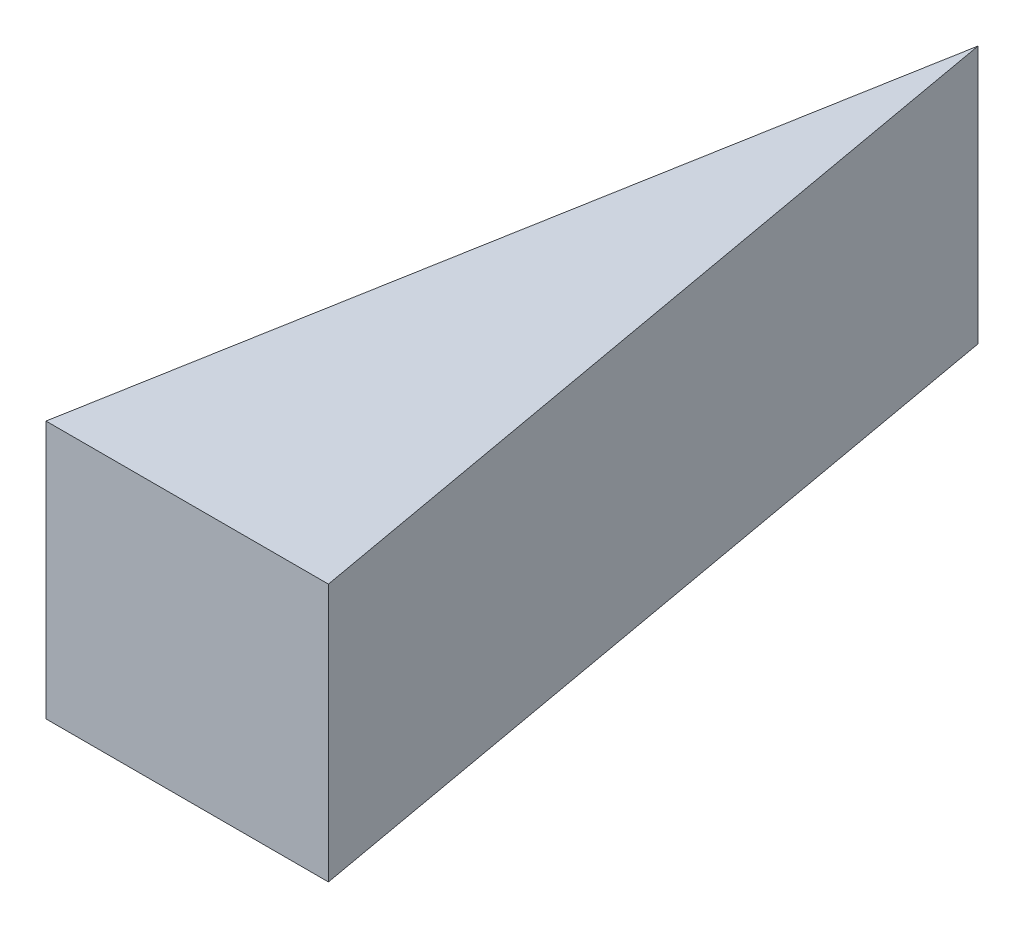
ISO-10303-21;
HEADER;
FILE_DESCRIPTION(('STEP AP214'),'2;1');
FILE_NAME('part.step','',(''),(''),'','','');
FILE_SCHEMA(('AUTOMOTIVE_DESIGN { 1 0 10303 214 1 1 1 1 }'));
ENDSEC;
DATA;
#1=APPLICATION_CONTEXT('core data for automotive mechanical design processes');
#2=APPLICATION_PROTOCOL_DEFINITION('international standard','automotive_design',2000,#1);
#3=PRODUCT_CONTEXT('',#1,'mechanical');
#4=PRODUCT('Part','Part','',(#3));
#5=PRODUCT_RELATED_PRODUCT_CATEGORY('part','',(#4));
#6=PRODUCT_DEFINITION_FORMATION('','',#4);
#7=PRODUCT_DEFINITION_CONTEXT('part definition',#1,'design');
#8=PRODUCT_DEFINITION('design','',#6,#7);
#9=PRODUCT_DEFINITION_SHAPE('','',#8);
#10=(LENGTH_UNIT() NAMED_UNIT(*) SI_UNIT(.MILLI.,.METRE.));
#11=(NAMED_UNIT(*) PLANE_ANGLE_UNIT() SI_UNIT($,.RADIAN.));
#12=(NAMED_UNIT(*) SI_UNIT($,.STERADIAN.) SOLID_ANGLE_UNIT());
#13=UNCERTAINTY_MEASURE_WITH_UNIT(LENGTH_MEASURE(1.E-05),#10,'distance_accuracy_value','');
#14=(GEOMETRIC_REPRESENTATION_CONTEXT(3) GLOBAL_UNCERTAINTY_ASSIGNED_CONTEXT((#13)) GLOBAL_UNIT_ASSIGNED_CONTEXT((#10,
#11,#12)) REPRESENTATION_CONTEXT('',''));
#15=CARTESIAN_POINT('',(0.,0.,0.));
#16=DIRECTION('',(0.,0.,1.));
#17=DIRECTION('',(1.,0.,0.));
#18=AXIS2_PLACEMENT_3D('',#15,#16,#17);
#19=CARTESIAN_POINT('',(0.,-65.09,0.));
#20=DIRECTION('',(0.,-1.,0.));
#21=DIRECTION('',(0.,0.,-1.));
#22=AXIS2_PLACEMENT_3D('',#19,#20,#21);
#23=PLANE('',#22);
#24=DIRECTION('',(-0.175798016675712,0.,-0.984426257945656));
#25=VECTOR('',#24,1.);
#26=CARTESIAN_POINT('',(71.265,-65.09,399.06671644601));
#27=LINE('',#26,#25);
#28=CARTESIAN_POINT('',(71.265,-65.09,399.06671644601));
#29=VERTEX_POINT('',#28);
#30=CARTESIAN_POINT('',(0.,-65.09,0.));
#31=VERTEX_POINT('',#30);
#32=EDGE_CURVE('E115',#29,#31,#27,.T.);
#33=ORIENTED_EDGE('',*,*,#32,.F.);
#34=DIRECTION('',(1.,0.,0.));
#35=VECTOR('',#34,1.);
#36=CARTESIAN_POINT('',(-71.265,-65.09,399.06671644601));
#37=LINE('',#36,#35);
#38=CARTESIAN_POINT('',(-71.265,-65.09,399.06671644601));
#39=VERTEX_POINT('',#38);
#40=EDGE_CURVE('E73',#39,#29,#37,.T.);
#41=ORIENTED_EDGE('',*,*,#40,.F.);
#42=DIRECTION('',(-0.175798016675712,0.,0.984426257945656));
#43=VECTOR('',#42,1.);
#44=CARTESIAN_POINT('',(0.,-65.09,0.));
#45=LINE('',#44,#43);
#46=EDGE_CURVE('E119',#31,#39,#45,.T.);
#47=ORIENTED_EDGE('',*,*,#46,.F.);
#48=EDGE_LOOP('',(#33,#41,#47));
#49=FACE_BOUND('',#48,.T.);
#50=DIRECTION('',(1.,0.,0.));
#51=VECTOR('',#50,1.);
#52=CARTESIAN_POINT('',(0.,-65.09,394.06671644601));
#53=LINE('',#52,#51);
#54=CARTESIAN_POINT('',(-65.2930035849032,-65.09,394.06671644601));
#55=VERTEX_POINT('',#54);
#56=CARTESIAN_POINT('',(65.2930035849032,-65.09,394.06671644601));
#57=VERTEX_POINT('',#56);
#58=EDGE_CURVE('E47',#55,#57,#53,.T.);
#59=ORIENTED_EDGE('',*,*,#58,.T.);
#60=DIRECTION('',(-0.175798016675712,0.,-0.984426257945656));
#61=VECTOR('',#60,1.);
#62=CARTESIAN_POINT('',(-4.92213128972828,-65.09,0.878990083378559));
#63=LINE('',#62,#61);
#64=CARTESIAN_POINT('',(0.,-65.09,28.4417315652845));
#65=VERTEX_POINT('',#64);
#66=EDGE_CURVE('E125',#57,#65,#63,.T.);
#67=ORIENTED_EDGE('',*,*,#66,.T.);
#68=DIRECTION('',(-0.175798016675712,0.,0.984426257945656));
#69=VECTOR('',#68,1.);
#70=CARTESIAN_POINT('',(4.92213128972828,-65.09,0.878990083378558));
#71=LINE('',#70,#69);
#72=EDGE_CURVE('E114',#65,#55,#71,.T.);
#73=ORIENTED_EDGE('',*,*,#72,.T.);
#74=EDGE_LOOP('',(#59,#67,#73));
#75=FACE_BOUND('',#74,.T.);
#76=ADVANCED_FACE('F32',(#49,#75),#23,.T.);
#77=CARTESIAN_POINT('',(71.265,65.09,399.06671644601));
#78=DIRECTION('',(-0.984426257945656,0.,0.175798016675712));
#79=DIRECTION('',(0.175798016675712,0.,0.984426257945656));
#80=AXIS2_PLACEMENT_3D('',#77,#78,#79);
#81=PLANE('',#80);
#82=ORIENTED_EDGE('',*,*,#32,.T.);
#83=DIRECTION('',(0.,-1.,0.));
#84=VECTOR('',#83,1.);
#85=CARTESIAN_POINT('',(0.,65.09,0.));
#86=LINE('',#85,#84);
#87=CARTESIAN_POINT('',(0.,65.09,0.));
#88=VERTEX_POINT('',#87);
#89=EDGE_CURVE('E11',#88,#31,#86,.T.);
#90=ORIENTED_EDGE('',*,*,#89,.F.);
#91=DIRECTION('',(-0.175798016675712,0.,-0.984426257945656));
#92=VECTOR('',#91,1.);
#93=CARTESIAN_POINT('',(71.265,65.09,399.06671644601));
#94=LINE('',#93,#92);
#95=CARTESIAN_POINT('',(71.265,65.09,399.06671644601));
#96=VERTEX_POINT('',#95);
#97=EDGE_CURVE('E129',#96,#88,#94,.T.);
#98=ORIENTED_EDGE('',*,*,#97,.F.);
#99=DIRECTION('',(0.,-1.,0.));
#100=VECTOR('',#99,1.);
#101=CARTESIAN_POINT('',(71.265,65.09,399.06671644601));
#102=LINE('',#101,#100);
#103=EDGE_CURVE('E132',#96,#29,#102,.T.);
#104=ORIENTED_EDGE('',*,*,#103,.T.);
#105=EDGE_LOOP('',(#82,#90,#98,#104));
#106=FACE_BOUND('',#105,.T.);
#107=ADVANCED_FACE('F34',(#106),#81,.F.);
#108=CARTESIAN_POINT('',(0.,65.09,0.));
#109=DIRECTION('',(0.984426257945656,0.,0.175798016675712));
#110=DIRECTION('',(0.175798016675712,0.,-0.984426257945656));
#111=AXIS2_PLACEMENT_3D('',#108,#109,#110);
#112=PLANE('',#111);
#113=ORIENTED_EDGE('',*,*,#46,.T.);
#114=DIRECTION('',(0.,-1.,0.));
#115=VECTOR('',#114,1.);
#116=CARTESIAN_POINT('',(-71.265,65.09,399.06671644601));
#117=LINE('',#116,#115);
#118=CARTESIAN_POINT('',(-71.265,65.09,399.06671644601));
#119=VERTEX_POINT('',#118);
#120=EDGE_CURVE('E40',#119,#39,#117,.T.);
#121=ORIENTED_EDGE('',*,*,#120,.F.);
#122=DIRECTION('',(-0.175798016675712,0.,0.984426257945656));
#123=VECTOR('',#122,1.);
#124=CARTESIAN_POINT('',(0.,65.09,0.));
#125=LINE('',#124,#123);
#126=EDGE_CURVE('E78',#88,#119,#125,.T.);
#127=ORIENTED_EDGE('',*,*,#126,.F.);
#128=ORIENTED_EDGE('',*,*,#89,.T.);
#129=EDGE_LOOP('',(#113,#121,#127,#128));
#130=FACE_BOUND('',#129,.T.);
#131=ADVANCED_FACE('F151',(#130),#112,.F.);
#132=CARTESIAN_POINT('',(-71.265,65.09,399.06671644601));
#133=DIRECTION('',(0.,0.,-1.));
#134=DIRECTION('',(-1.,0.,0.));
#135=AXIS2_PLACEMENT_3D('',#132,#133,#134);
#136=PLANE('',#135);
#137=ORIENTED_EDGE('',*,*,#40,.T.);
#138=ORIENTED_EDGE('',*,*,#103,.F.);
#139=DIRECTION('',(1.,0.,0.));
#140=VECTOR('',#139,1.);
#141=CARTESIAN_POINT('',(-71.265,65.09,399.06671644601));
#142=LINE('',#141,#140);
#143=EDGE_CURVE('E56',#119,#96,#142,.T.);
#144=ORIENTED_EDGE('',*,*,#143,.F.);
#145=ORIENTED_EDGE('',*,*,#120,.T.);
#146=EDGE_LOOP('',(#137,#138,#144,#145));
#147=FACE_BOUND('',#146,.T.);
#148=ADVANCED_FACE('F136',(#147),#136,.F.);
#149=CARTESIAN_POINT('',(0.,65.09,0.));
#150=DIRECTION('',(0.,-1.,0.));
#151=DIRECTION('',(0.,0.,-1.));
#152=AXIS2_PLACEMENT_3D('',#149,#150,#151);
#153=PLANE('',#152);
#154=ORIENTED_EDGE('',*,*,#97,.T.);
#155=ORIENTED_EDGE('',*,*,#126,.T.);
#156=ORIENTED_EDGE('',*,*,#143,.T.);
#157=EDGE_LOOP('',(#154,#155,#156));
#158=FACE_BOUND('',#157,.T.);
#159=ADVANCED_FACE('F143',(#158),#153,.F.);
#160=CARTESIAN_POINT('',(66.3428687102717,65.09,399.945706529388));
#161=DIRECTION('',(-0.984426257945656,0.,0.175798016675712));
#162=DIRECTION('',(0.175798016675712,0.,0.984426257945656));
#163=AXIS2_PLACEMENT_3D('',#160,#161,#162);
#164=PLANE('',#163);
#165=ORIENTED_EDGE('',*,*,#66,.F.);
#166=DIRECTION('',(0.,-1.,0.));
#167=VECTOR('',#166,1.);
#168=CARTESIAN_POINT('',(65.2930035849032,65.09,394.06671644601));
#169=LINE('',#168,#167);
#170=CARTESIAN_POINT('',(65.2930035849032,60.09,394.06671644601));
#171=VERTEX_POINT('',#170);
#172=EDGE_CURVE('E110',#171,#57,#169,.T.);
#173=ORIENTED_EDGE('',*,*,#172,.F.);
#174=DIRECTION('',(-0.175798016675712,0.,-0.984426257945656));
#175=VECTOR('',#174,1.);
#176=CARTESIAN_POINT('',(-4.92213128972828,60.09,0.878990083378559));
#177=LINE('',#176,#175);
#178=CARTESIAN_POINT('',(0.,60.09,28.4417315652845));
#179=VERTEX_POINT('',#178);
#180=EDGE_CURVE('E98',#171,#179,#177,.T.);
#181=ORIENTED_EDGE('',*,*,#180,.T.);
#182=DIRECTION('',(0.,-1.,0.));
#183=VECTOR('',#182,1.);
#184=CARTESIAN_POINT('',(0.,65.09,28.4417315652845));
#185=LINE('',#184,#183);
#186=EDGE_CURVE('E108',#179,#65,#185,.T.);
#187=ORIENTED_EDGE('',*,*,#186,.T.);
#188=EDGE_LOOP('',(#165,#173,#181,#187));
#189=FACE_BOUND('',#188,.T.);
#190=ADVANCED_FACE('F107',(#189),#164,.T.);
#191=CARTESIAN_POINT('',(4.92213128972828,65.09,0.878990083378558));
#192=DIRECTION('',(0.984426257945656,0.,0.175798016675712));
#193=DIRECTION('',(0.175798016675712,0.,-0.984426257945656));
#194=AXIS2_PLACEMENT_3D('',#191,#192,#193);
#195=PLANE('',#194);
#196=ORIENTED_EDGE('',*,*,#72,.F.);
#197=ORIENTED_EDGE('',*,*,#186,.F.);
#198=DIRECTION('',(-0.175798016675712,0.,0.984426257945656));
#199=VECTOR('',#198,1.);
#200=CARTESIAN_POINT('',(4.92213128972828,60.09,0.878990083378558));
#201=LINE('',#200,#199);
#202=CARTESIAN_POINT('',(-65.2930035849032,60.09,394.06671644601));
#203=VERTEX_POINT('',#202);
#204=EDGE_CURVE('E95',#179,#203,#201,.T.);
#205=ORIENTED_EDGE('',*,*,#204,.T.);
#206=DIRECTION('',(0.,-1.,0.));
#207=VECTOR('',#206,1.);
#208=CARTESIAN_POINT('',(-65.2930035849032,65.09,394.06671644601));
#209=LINE('',#208,#207);
#210=EDGE_CURVE('E116',#203,#55,#209,.T.);
#211=ORIENTED_EDGE('',*,*,#210,.T.);
#212=EDGE_LOOP('',(#196,#197,#205,#211));
#213=FACE_BOUND('',#212,.T.);
#214=ADVANCED_FACE('F112',(#213),#195,.T.);
#215=CARTESIAN_POINT('',(-71.265,65.09,394.06671644601));
#216=DIRECTION('',(0.,0.,-1.));
#217=DIRECTION('',(-1.,0.,0.));
#218=AXIS2_PLACEMENT_3D('',#215,#216,#217);
#219=PLANE('',#218);
#220=ORIENTED_EDGE('',*,*,#58,.F.);
#221=ORIENTED_EDGE('',*,*,#210,.F.);
#222=DIRECTION('',(1.,0.,0.));
#223=VECTOR('',#222,1.);
#224=CARTESIAN_POINT('',(0.,60.09,394.06671644601));
#225=LINE('',#224,#223);
#226=EDGE_CURVE('E99',#203,#171,#225,.T.);
#227=ORIENTED_EDGE('',*,*,#226,.T.);
#228=ORIENTED_EDGE('',*,*,#172,.T.);
#229=EDGE_LOOP('',(#220,#221,#227,#228));
#230=FACE_BOUND('',#229,.T.);
#231=ADVANCED_FACE('F191',(#230),#219,.T.);
#232=CARTESIAN_POINT('',(0.,60.09,0.));
#233=DIRECTION('',(0.,-1.,0.));
#234=DIRECTION('',(0.,0.,-1.));
#235=AXIS2_PLACEMENT_3D('',#232,#233,#234);
#236=PLANE('',#235);
#237=ORIENTED_EDGE('',*,*,#180,.F.);
#238=ORIENTED_EDGE('',*,*,#226,.F.);
#239=ORIENTED_EDGE('',*,*,#204,.F.);
#240=EDGE_LOOP('',(#237,#238,#239));
#241=FACE_BOUND('',#240,.T.);
#242=ADVANCED_FACE('F97',(#241),#236,.T.);
#243=CLOSED_SHELL('',(#76,#107,#131,#148,#159,#190,#214,#231,#242));
#244=MANIFOLD_SOLID_BREP('B2',#243);
#245=ADVANCED_BREP_SHAPE_REPRESENTATION('',(#18,#244),#14);
#246=SHAPE_DEFINITION_REPRESENTATION(#9,#245);
ENDSEC;
END-ISO-10303-21;
